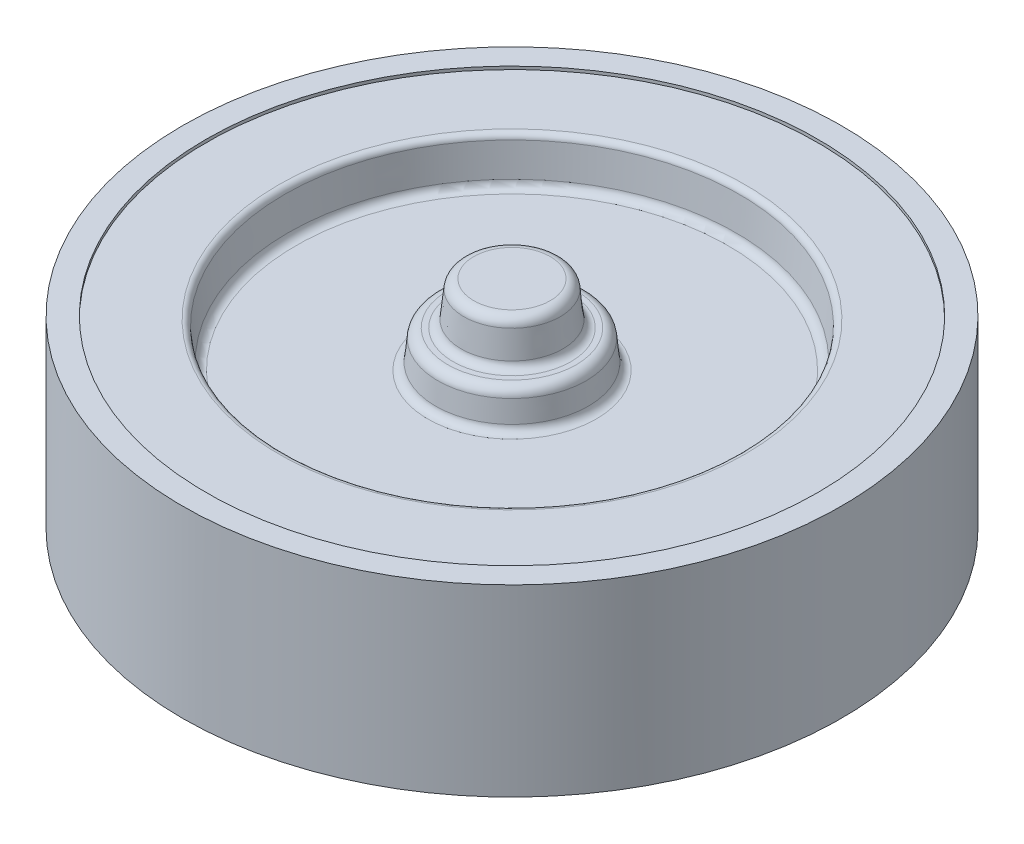
ISO-10303-21;
HEADER;
FILE_DESCRIPTION(('STEP AP214'),'2;1');
FILE_NAME('part.step','',(''),(''),'','','');
FILE_SCHEMA(('AUTOMOTIVE_DESIGN { 1 0 10303 214 1 1 1 1 }'));
ENDSEC;
DATA;
#1=APPLICATION_CONTEXT('core data for automotive mechanical design processes');
#2=APPLICATION_PROTOCOL_DEFINITION('international standard','automotive_design',2000,#1);
#3=PRODUCT_CONTEXT('',#1,'mechanical');
#4=PRODUCT('Part','Part','',(#3));
#5=PRODUCT_RELATED_PRODUCT_CATEGORY('part','',(#4));
#6=PRODUCT_DEFINITION_FORMATION('','',#4);
#7=PRODUCT_DEFINITION_CONTEXT('part definition',#1,'design');
#8=PRODUCT_DEFINITION('design','',#6,#7);
#9=PRODUCT_DEFINITION_SHAPE('','',#8);
#10=(LENGTH_UNIT() NAMED_UNIT(*) SI_UNIT(.MILLI.,.METRE.));
#11=(NAMED_UNIT(*) PLANE_ANGLE_UNIT() SI_UNIT($,.RADIAN.));
#12=(NAMED_UNIT(*) SI_UNIT($,.STERADIAN.) SOLID_ANGLE_UNIT());
#13=UNCERTAINTY_MEASURE_WITH_UNIT(LENGTH_MEASURE(1.E-05),#10,'distance_accuracy_value','');
#14=(GEOMETRIC_REPRESENTATION_CONTEXT(3) GLOBAL_UNCERTAINTY_ASSIGNED_CONTEXT((#13)) GLOBAL_UNIT_ASSIGNED_CONTEXT((#10,
#11,#12)) REPRESENTATION_CONTEXT('',''));
#15=CARTESIAN_POINT('',(0.,0.,0.));
#16=DIRECTION('',(0.,0.,1.));
#17=DIRECTION('',(1.,0.,0.));
#18=AXIS2_PLACEMENT_3D('',#15,#16,#17);
#19=CARTESIAN_POINT('',(199.087726742336,92.0345915435248,-165.01));
#20=DIRECTION('',(0.,1.,0.));
#21=DIRECTION('',(-1.,0.,0.));
#22=AXIS2_PLACEMENT_3D('',#19,#20,#21);
#23=PLANE('',#22);
#24=CARTESIAN_POINT('',(0.,92.0345915435248,0.));
#25=DIRECTION('',(0.,1.,0.));
#26=DIRECTION('',(-1.,0.,0.));
#27=AXIS2_PLACEMENT_3D('',#24,#25,#26);
#28=CIRCLE('',#27,165.);
#29=CARTESIAN_POINT('',(-165.,92.0345915435247,0.));
#30=VERTEX_POINT('',#29);
#31=EDGE_CURVE('E46',#30,#30,#28,.T.);
#32=ORIENTED_EDGE('',*,*,#31,.T.);
#33=EDGE_LOOP('',(#32));
#34=FACE_BOUND('',#33,.T.);
#35=CARTESIAN_POINT('',(-2.47096585527321E-13,92.0345915435248,2.51507432125404E-13));
#36=DIRECTION('',(0.,1.,0.));
#37=DIRECTION('',(-1.,0.,0.));
#38=AXIS2_PLACEMENT_3D('',#35,#36,#37);
#39=CIRCLE('',#38,153.205859623628);
#40=CARTESIAN_POINT('',(-153.205859623629,92.0345915435248,2.51507432125404E-13));
#41=VERTEX_POINT('',#40);
#42=EDGE_CURVE('E60',#41,#41,#39,.F.);
#43=ORIENTED_EDGE('',*,*,#42,.T.);
#44=EDGE_LOOP('',(#43));
#45=FACE_BOUND('',#44,.T.);
#46=ADVANCED_FACE('F42',(#34,#45),#23,.T.);
#47=CARTESIAN_POINT('',(111.8,68.4000000000003,1.68987696800009E-13));
#48=DIRECTION('',(0.,-1.,0.));
#49=DIRECTION('',(1.,0.,0.));
#50=AXIS2_PLACEMENT_3D('',#47,#48,#49);
#51=PLANE('',#50);
#52=CARTESIAN_POINT('',(-1.66024051546071E-13,68.4,1.68987696800007E-13));
#53=DIRECTION('',(0.,-1.,0.));
#54=DIRECTION('',(1.,0.,0.));
#55=AXIS2_PLACEMENT_3D('',#52,#53,#54);
#56=CIRCLE('',#55,42.2016161771913);
#57=CARTESIAN_POINT('',(42.2016161771911,68.4000000000001,1.68987696800008E-13));
#58=VERTEX_POINT('',#57);
#59=EDGE_CURVE('E98',#58,#58,#56,.F.);
#60=ORIENTED_EDGE('',*,*,#59,.F.);
#61=EDGE_LOOP('',(#60));
#62=FACE_BOUND('',#61,.T.);
#63=CARTESIAN_POINT('',(-1.66024051546071E-13,68.4,1.68987696800007E-13));
#64=DIRECTION('',(0.,-1.,0.));
#65=DIRECTION('',(1.,0.,0.));
#66=AXIS2_PLACEMENT_3D('',#63,#64,#65);
#67=CIRCLE('',#66,108.198383822808);
#68=CARTESIAN_POINT('',(108.198383822808,68.4000000000003,1.68987696800009E-13));
#69=VERTEX_POINT('',#68);
#70=EDGE_CURVE('E110',#69,#69,#67,.T.);
#71=ORIENTED_EDGE('',*,*,#70,.F.);
#72=EDGE_LOOP('',(#71));
#73=FACE_BOUND('',#72,.T.);
#74=ADVANCED_FACE('F137',(#62,#73),#51,.F.);
#75=CARTESIAN_POINT('',(-1.79745047541614E-13,72.4,1.8295362215538E-13));
#76=DIRECTION('',(0.,-1.,0.));
#77=DIRECTION('',(1.,0.,0.));
#78=AXIS2_PLACEMENT_3D('',#75,#76,#77);
#79=TOROIDAL_SURFACE('',#78,108.198383822808,4.);
#80=CARTESIAN_POINT('',(-1.78310812915698E-13,71.9818861469292,1.81493785439872E-13));
#81=DIRECTION('',(0.,-1.,0.));
#82=DIRECTION('',(1.,0.,0.));
#83=AXIS2_PLACEMENT_3D('',#80,#81,#82);
#84=CIRCLE('',#83,112.176471404282);
#85=CARTESIAN_POINT('',(112.176471404281,71.9818861469296,1.81493785439873E-13));
#86=VERTEX_POINT('',#85);
#87=EDGE_CURVE('E106',#86,#86,#84,.F.);
#88=ORIENTED_EDGE('',*,*,#87,.T.);
#89=EDGE_LOOP('',(#88));
#90=FACE_BOUND('',#89,.T.);
#91=ORIENTED_EDGE('',*,*,#70,.T.);
#92=EDGE_LOOP('',(#91));
#93=FACE_BOUND('',#92,.T.);
#94=ADVANCED_FACE('F139',(#90,#93),#79,.F.);
#95=CARTESIAN_POINT('',(-1.66024051546071E-13,68.3999999999998,1.68987696800007E-13));
#96=DIRECTION('',(0.,1.,0.));
#97=DIRECTION('',(-1.,0.,0.));
#98=AXIS2_PLACEMENT_3D('',#95,#96,#97);
#99=CONICAL_SURFACE('',#98,111.8,0.104719755119656);
#100=CARTESIAN_POINT('',(-2.32670966270791E-13,87.8291769333271,2.36824305491801E-13));
#101=DIRECTION('',(0.,1.,0.));
#102=DIRECTION('',(-1.,0.,0.));
#103=AXIS2_PLACEMENT_3D('',#100,#101,#102);
#104=CIRCLE('',#103,113.842088783419);
#105=CARTESIAN_POINT('',(-113.842088783419,87.8291769333268,2.36824305491799E-13));
#106=VERTEX_POINT('',#105);
#107=EDGE_CURVE('E86',#106,#106,#104,.F.);
#108=ORIENTED_EDGE('',*,*,#107,.F.);
#109=EDGE_LOOP('',(#108));
#110=FACE_BOUND('',#109,.T.);
#111=ORIENTED_EDGE('',*,*,#87,.F.);
#112=EDGE_LOOP('',(#111));
#113=FACE_BOUND('',#112,.T.);
#114=ADVANCED_FACE('F146',(#110,#113),#99,.F.);
#115=CARTESIAN_POINT('',(-2.31595290301354E-13,87.5155915435242,2.3572942795517E-13));
#116=DIRECTION('',(0.,-1.,0.));
#117=DIRECTION('',(1.,0.,0.));
#118=AXIS2_PLACEMENT_3D('',#115,#116,#117);
#119=TOROIDAL_SURFACE('',#118,116.825654469524,3.);
#120=CARTESIAN_POINT('',(-2.41886037298012E-13,90.5155915435242,2.46203871971699E-13));
#121=DIRECTION('',(0.,-1.,0.));
#122=DIRECTION('',(1.,0.,0.));
#123=AXIS2_PLACEMENT_3D('',#120,#121,#122);
#124=CIRCLE('',#123,116.825654469524);
#125=CARTESIAN_POINT('',(116.825654469523,90.5155915435246,2.46203871971701E-13));
#126=VERTEX_POINT('',#125);
#127=EDGE_CURVE('E82',#126,#126,#124,.F.);
#128=ORIENTED_EDGE('',*,*,#127,.T.);
#129=EDGE_LOOP('',(#128));
#130=FACE_BOUND('',#129,.T.);
#131=ORIENTED_EDGE('',*,*,#107,.T.);
#132=EDGE_LOOP('',(#131));
#133=FACE_BOUND('',#132,.T.);
#134=ADVANCED_FACE('F177',(#130,#133),#119,.T.);
#135=CARTESIAN_POINT('',(153.205859623628,90.5155915435247,2.46203871971701E-13));
#136=DIRECTION('',(0.,-1.,0.));
#137=DIRECTION('',(1.,0.,0.));
#138=AXIS2_PLACEMENT_3D('',#135,#136,#137);
#139=PLANE('',#138);
#140=ORIENTED_EDGE('',*,*,#127,.F.);
#141=EDGE_LOOP('',(#140));
#142=FACE_BOUND('',#141,.T.);
#143=CARTESIAN_POINT('',(-2.41886037298011E-13,90.5155915435243,2.462038719717E-13));
#144=DIRECTION('',(0.,-1.,0.));
#145=DIRECTION('',(1.,0.,0.));
#146=AXIS2_PLACEMENT_3D('',#143,#144,#145);
#147=CIRCLE('',#146,153.205859623628);
#148=CARTESIAN_POINT('',(153.205859623628,90.5155915435248,2.46203871971701E-13));
#149=VERTEX_POINT('',#148);
#150=EDGE_CURVE('E10',#149,#149,#147,.T.);
#151=ORIENTED_EDGE('',*,*,#150,.F.);
#152=EDGE_LOOP('',(#151));
#153=FACE_BOUND('',#152,.T.);
#154=ADVANCED_FACE('F174',(#142,#153),#139,.F.);
#155=CARTESIAN_POINT('',(4.01151444638657E-12,-1149.45284371182,-4.08312278047684E-12));
#156=DIRECTION('',(0.,-1.,0.));
#157=DIRECTION('',(1.,0.,0.));
#158=AXIS2_PLACEMENT_3D('',#155,#156,#157);
#159=CYLINDRICAL_SURFACE('',#158,153.205859623628);
#160=ORIENTED_EDGE('',*,*,#150,.T.);
#161=EDGE_LOOP('',(#160));
#162=FACE_BOUND('',#161,.T.);
#163=ORIENTED_EDGE('',*,*,#42,.F.);
#164=EDGE_LOOP('',(#163));
#165=FACE_BOUND('',#164,.T.);
#166=ADVANCED_FACE('F163',(#162,#165),#159,.F.);
#167=CARTESIAN_POINT('',(-1.79745047541614E-13,72.4,1.8295362215538E-13));
#168=DIRECTION('',(0.,-1.,0.));
#169=DIRECTION('',(1.,0.,0.));
#170=AXIS2_PLACEMENT_3D('',#167,#168,#169);
#171=TOROIDAL_SURFACE('',#170,42.2016161771913,4.);
#172=ORIENTED_EDGE('',*,*,#59,.T.);
#173=EDGE_LOOP('',(#172));
#174=FACE_BOUND('',#173,.T.);
#175=CARTESIAN_POINT('',(-1.78310812915698E-13,71.9818861469294,1.81493785439872E-13));
#176=DIRECTION('',(0.,1.,0.));
#177=DIRECTION('',(-1.,0.,0.));
#178=AXIS2_PLACEMENT_3D('',#175,#176,#177);
#179=CIRCLE('',#178,38.2235285957182);
#180=CARTESIAN_POINT('',(-38.2235285957184,71.9818861469293,1.81493785439872E-13));
#181=VERTEX_POINT('',#180);
#182=EDGE_CURVE('E102',#181,#181,#179,.F.);
#183=ORIENTED_EDGE('',*,*,#182,.T.);
#184=EDGE_LOOP('',(#183));
#185=FACE_BOUND('',#184,.T.);
#186=ADVANCED_FACE('F158',(#174,#185),#171,.F.);
#187=CARTESIAN_POINT('',(-2.29483658025457E-13,86.8999999999999,2.33580101568605E-13));
#188=DIRECTION('',(0.,-1.,0.));
#189=DIRECTION('',(1.,0.,0.));
#190=AXIS2_PLACEMENT_3D('',#187,#188,#189);
#191=CONICAL_SURFACE('',#190,36.6555716475851,0.104719755119649);
#192=CARTESIAN_POINT('',(-2.14125206313424E-13,82.4226423163383,2.17947490768775E-13));
#193=DIRECTION('',(0.,-1.,0.));
#194=DIRECTION('',(1.,0.,0.));
#195=AXIS2_PLACEMENT_3D('',#192,#193,#194);
#196=CIRCLE('',#195,37.1261609029372);
#197=CARTESIAN_POINT('',(37.1261609029369,82.4226423163384,2.17947490768775E-13));
#198=VERTEX_POINT('',#197);
#199=EDGE_CURVE('E90',#198,#198,#196,.F.);
#200=ORIENTED_EDGE('',*,*,#199,.F.);
#201=EDGE_LOOP('',(#200));
#202=FACE_BOUND('',#201,.T.);
#203=ORIENTED_EDGE('',*,*,#182,.F.);
#204=EDGE_LOOP('',(#203));
#205=FACE_BOUND('',#204,.T.);
#206=ADVANCED_FACE('F131',(#202,#205),#191,.T.);
#207=CARTESIAN_POINT('',(-2.12332413031029E-13,81.9000000000001,2.1612269487439E-13));
#208=DIRECTION('',(0.,-1.,0.));
#209=DIRECTION('',(1.,0.,0.));
#210=AXIS2_PLACEMENT_3D('',#207,#208,#209);
#211=TOROIDAL_SURFACE('',#210,32.1535514260958,5.);
#212=ORIENTED_EDGE('',*,*,#199,.T.);
#213=EDGE_LOOP('',(#212));
#214=FACE_BOUND('',#213,.T.);
#215=CARTESIAN_POINT('',(-2.29483658025458E-13,86.9000000000001,2.33580101568606E-13));
#216=DIRECTION('',(0.,-1.,0.));
#217=DIRECTION('',(1.,0.,0.));
#218=AXIS2_PLACEMENT_3D('',#215,#216,#217);
#219=CIRCLE('',#218,32.1535514260958);
#220=CARTESIAN_POINT('',(32.1535514260956,86.9000000000002,2.33580101568606E-13));
#221=VERTEX_POINT('',#220);
#222=EDGE_CURVE('E94',#221,#221,#219,.T.);
#223=ORIENTED_EDGE('',*,*,#222,.T.);
#224=EDGE_LOOP('',(#223));
#225=FACE_BOUND('',#224,.T.);
#226=ADVANCED_FACE('F122',(#214,#225),#211,.T.);
#227=CARTESIAN_POINT('',(36.6555716475848,86.9000000000002,2.33580101568606E-13));
#228=DIRECTION('',(0.,-1.,0.));
#229=DIRECTION('',(1.,0.,0.));
#230=AXIS2_PLACEMENT_3D('',#227,#228,#229);
#231=PLANE('',#230);
#232=ORIENTED_EDGE('',*,*,#222,.F.);
#233=EDGE_LOOP('',(#232));
#234=FACE_BOUND('',#233,.T.);
#235=CARTESIAN_POINT('',(-2.29483658025458E-13,86.9000000000001,2.33580101568606E-13));
#236=DIRECTION('',(0.,-1.,0.));
#237=DIRECTION('',(1.,0.,0.));
#238=AXIS2_PLACEMENT_3D('',#235,#236,#237);
#239=CIRCLE('',#238,29.4914077066599);
#240=CARTESIAN_POINT('',(29.4914077066596,86.9000000000002,2.33580101568606E-13));
#241=VERTEX_POINT('',#240);
#242=EDGE_CURVE('E57',#241,#241,#239,.F.);
#243=ORIENTED_EDGE('',*,*,#242,.F.);
#244=EDGE_LOOP('',(#243));
#245=FACE_BOUND('',#244,.T.);
#246=ADVANCED_FACE('F120',(#234,#245),#231,.F.);
#247=CARTESIAN_POINT('',(-2.43204654021001E-13,90.9000000000001,2.47546026923979E-13));
#248=DIRECTION('',(0.,-1.,0.));
#249=DIRECTION('',(1.,0.,0.));
#250=AXIS2_PLACEMENT_3D('',#247,#248,#249);
#251=TOROIDAL_SURFACE('',#250,29.4914077066599,4.);
#252=ORIENTED_EDGE('',*,*,#242,.T.);
#253=EDGE_LOOP('',(#252));
#254=FACE_BOUND('',#253,.T.);
#255=CARTESIAN_POINT('',(-2.41770419395085E-13,90.4818861469295,2.46086190208471E-13));
#256=DIRECTION('',(0.,1.,0.));
#257=DIRECTION('',(-1.,0.,0.));
#258=AXIS2_PLACEMENT_3D('',#255,#256,#257);
#259=CIRCLE('',#258,25.5133201251868);
#260=CARTESIAN_POINT('',(-25.513320125187,90.4818861469295,2.46086190208471E-13));
#261=VERTEX_POINT('',#260);
#262=EDGE_CURVE('E51',#261,#261,#259,.F.);
#263=ORIENTED_EDGE('',*,*,#262,.T.);
#264=EDGE_LOOP('',(#263));
#265=FACE_BOUND('',#264,.T.);
#266=ADVANCED_FACE('F117',(#254,#265),#251,.F.);
#267=CARTESIAN_POINT('',(-3.02485124239475E-13,108.181681369991,3.07884694931134E-13));
#268=DIRECTION('',(0.,-1.,0.));
#269=DIRECTION('',(1.,0.,0.));
#270=AXIS2_PLACEMENT_3D('',#267,#268,#269);
#271=CONICAL_SURFACE('',#270,23.6529966839081,0.104719755119644);
#272=ORIENTED_EDGE('',*,*,#262,.F.);
#273=EDGE_LOOP('',(#272));
#274=FACE_BOUND('',#273,.T.);
#275=CARTESIAN_POINT('',(-2.8712667252744E-13,103.704323686329,2.92252084131303E-13));
#276=DIRECTION('',(0.,-1.,0.));
#277=DIRECTION('',(1.,0.,0.));
#278=AXIS2_PLACEMENT_3D('',#275,#276,#277);
#279=CIRCLE('',#278,24.1235859392602);
#280=CARTESIAN_POINT('',(24.1235859392599,103.704323686329,2.92252084131303E-13));
#281=VERTEX_POINT('',#280);
#282=EDGE_CURVE('E63',#281,#281,#279,.F.);
#283=ORIENTED_EDGE('',*,*,#282,.F.);
#284=EDGE_LOOP('',(#283));
#285=FACE_BOUND('',#284,.T.);
#286=ADVANCED_FACE('F129',(#274,#285),#271,.T.);
#287=CARTESIAN_POINT('',(0.,240.,0.));
#288=DIRECTION('',(0.,-1.,0.));
#289=DIRECTION('',(0.,0.,-1.));
#290=AXIS2_PLACEMENT_3D('',#287,#288,#289);
#291=CYLINDRICAL_SURFACE('',#290,165.);
#292=CARTESIAN_POINT('',(0.,0.,0.));
#293=DIRECTION('',(0.,1.,0.));
#294=DIRECTION('',(0.,0.,1.));
#295=AXIS2_PLACEMENT_3D('',#292,#293,#294);
#296=CIRCLE('',#295,165.);
#297=CARTESIAN_POINT('',(0.,0.,165.));
#298=VERTEX_POINT('',#297);
#299=EDGE_CURVE('E69',#298,#298,#296,.T.);
#300=ORIENTED_EDGE('',*,*,#299,.T.);
#301=EDGE_LOOP('',(#300));
#302=FACE_BOUND('',#301,.T.);
#303=ORIENTED_EDGE('',*,*,#31,.F.);
#304=EDGE_LOOP('',(#303));
#305=FACE_BOUND('',#304,.T.);
#306=ADVANCED_FACE('F44',(#302,#305),#291,.T.);
#307=CARTESIAN_POINT('',(0.,0.,0.));
#308=DIRECTION('',(0.,1.,0.));
#309=DIRECTION('',(0.,0.,1.));
#310=AXIS2_PLACEMENT_3D('',#307,#308,#309);
#311=PLANE('',#310);
#312=ORIENTED_EDGE('',*,*,#299,.F.);
#313=EDGE_LOOP('',(#312));
#314=FACE_BOUND('',#313,.T.);
#315=ADVANCED_FACE('F152',(#314),#311,.F.);
#316=CARTESIAN_POINT('',(-2.87468629451377E-13,108.181681369991,3.07884694931134E-13));
#317=DIRECTION('',(0.,-1.,0.));
#318=DIRECTION('',(1.,0.,0.));
#319=AXIS2_PLACEMENT_3D('',#316,#317,#318);
#320=PLANE('',#319);
#321=CARTESIAN_POINT('',(-3.02485124239474E-13,108.181681369991,3.07884694931134E-13));
#322=DIRECTION('',(0.,-1.,0.));
#323=DIRECTION('',(1.,0.,0.));
#324=AXIS2_PLACEMENT_3D('',#321,#322,#323);
#325=CIRCLE('',#324,19.1509764624189);
#326=CARTESIAN_POINT('',(19.1509764624186,108.181681369991,3.07884694931134E-13));
#327=VERTEX_POINT('',#326);
#328=EDGE_CURVE('E71',#327,#327,#325,.T.);
#329=ORIENTED_EDGE('',*,*,#328,.F.);
#330=EDGE_LOOP('',(#329));
#331=FACE_BOUND('',#330,.T.);
#332=ADVANCED_FACE('F284',(#331),#320,.F.);
#333=CARTESIAN_POINT('',(-2.85333879245046E-13,103.181681369991,2.90427288236918E-13));
#334=DIRECTION('',(0.,-1.,0.));
#335=DIRECTION('',(1.,0.,0.));
#336=AXIS2_PLACEMENT_3D('',#333,#334,#335);
#337=TOROIDAL_SURFACE('',#336,19.1509764624189,5.);
#338=ORIENTED_EDGE('',*,*,#282,.T.);
#339=EDGE_LOOP('',(#338));
#340=FACE_BOUND('',#339,.T.);
#341=ORIENTED_EDGE('',*,*,#328,.T.);
#342=EDGE_LOOP('',(#341));
#343=FACE_BOUND('',#342,.T.);
#344=ADVANCED_FACE('F151',(#340,#343),#337,.T.);
#345=CLOSED_SHELL('',(#46,#74,#94,#114,#134,#154,#166,#186,#206,#226,#246,#266,#286,#306,#315,
#332,#344));
#346=MANIFOLD_SOLID_BREP('B2',#345);
#347=ADVANCED_BREP_SHAPE_REPRESENTATION('',(#18,#346),#14);
#348=SHAPE_DEFINITION_REPRESENTATION(#9,#347);
ENDSEC;
END-ISO-10303-21;
